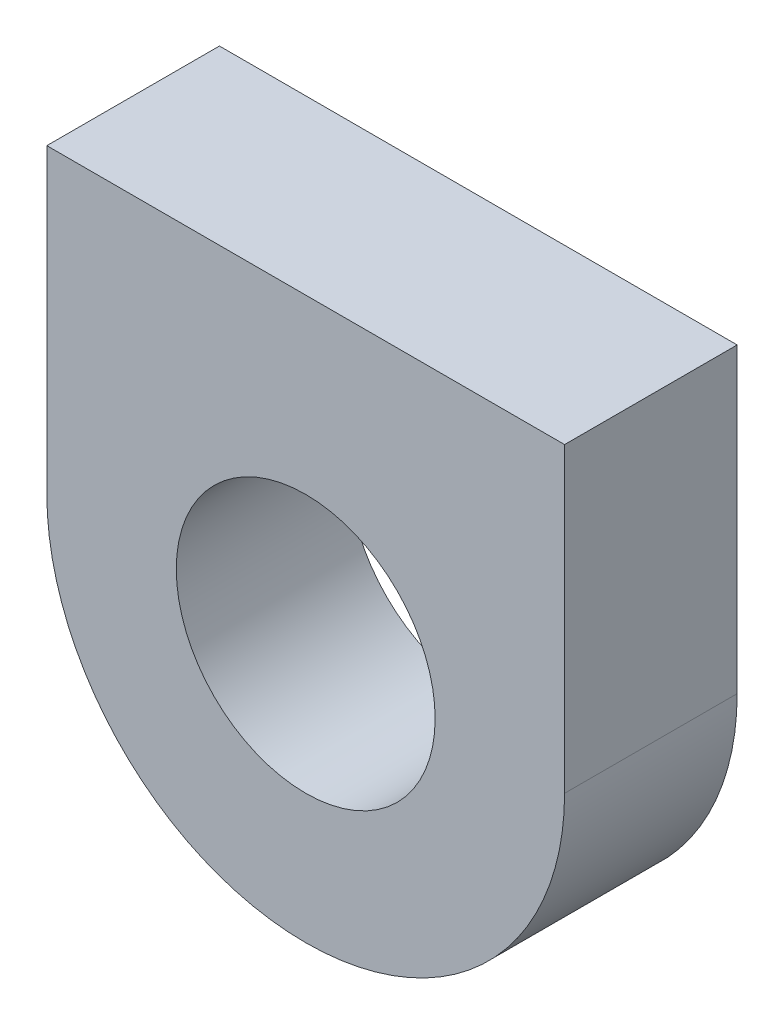
ISO-10303-21;
HEADER;
FILE_DESCRIPTION(('STEP AP214'),'2;1');
FILE_NAME('part.step','',(''),(''),'','','');
FILE_SCHEMA(('AUTOMOTIVE_DESIGN { 1 0 10303 214 1 1 1 1 }'));
ENDSEC;
DATA;
#1=APPLICATION_CONTEXT('core data for automotive mechanical design processes');
#2=APPLICATION_PROTOCOL_DEFINITION('international standard','automotive_design',2000,#1);
#3=PRODUCT_CONTEXT('',#1,'mechanical');
#4=PRODUCT('Part','Part','',(#3));
#5=PRODUCT_RELATED_PRODUCT_CATEGORY('part','',(#4));
#6=PRODUCT_DEFINITION_FORMATION('','',#4);
#7=PRODUCT_DEFINITION_CONTEXT('part definition',#1,'design');
#8=PRODUCT_DEFINITION('design','',#6,#7);
#9=PRODUCT_DEFINITION_SHAPE('','',#8);
#10=(LENGTH_UNIT() NAMED_UNIT(*) SI_UNIT(.MILLI.,.METRE.));
#11=(NAMED_UNIT(*) PLANE_ANGLE_UNIT() SI_UNIT($,.RADIAN.));
#12=(NAMED_UNIT(*) SI_UNIT($,.STERADIAN.) SOLID_ANGLE_UNIT());
#13=UNCERTAINTY_MEASURE_WITH_UNIT(LENGTH_MEASURE(1.E-05),#10,'distance_accuracy_value','');
#14=(GEOMETRIC_REPRESENTATION_CONTEXT(3) GLOBAL_UNCERTAINTY_ASSIGNED_CONTEXT((#13)) GLOBAL_UNIT_ASSIGNED_CONTEXT((#10,
#11,#12)) REPRESENTATION_CONTEXT('',''));
#15=CARTESIAN_POINT('',(0.,0.,0.));
#16=DIRECTION('',(0.,0.,1.));
#17=DIRECTION('',(1.,0.,0.));
#18=AXIS2_PLACEMENT_3D('',#15,#16,#17);
#19=CARTESIAN_POINT('',(0.,0.,10.));
#20=DIRECTION('',(0.,0.,1.));
#21=DIRECTION('',(1.,0.,0.));
#22=AXIS2_PLACEMENT_3D('',#19,#20,#21);
#23=PLANE('',#22);
#24=CARTESIAN_POINT('',(0.,0.,10.));
#25=DIRECTION('',(0.,0.,1.));
#26=DIRECTION('',(1.,0.,0.));
#27=AXIS2_PLACEMENT_3D('',#24,#25,#26);
#28=CIRCLE('',#27,30.);
#29=CARTESIAN_POINT('',(-30.,0.,10.));
#30=VERTEX_POINT('',#29);
#31=CARTESIAN_POINT('',(30.,0.,10.));
#32=VERTEX_POINT('',#31);
#33=EDGE_CURVE('E87',#30,#32,#28,.T.);
#34=ORIENTED_EDGE('',*,*,#33,.T.);
#35=DIRECTION('',(0.,1.,0.));
#36=VECTOR('',#35,1.);
#37=CARTESIAN_POINT('',(30.,35.,10.));
#38=LINE('',#37,#36);
#39=CARTESIAN_POINT('',(30.,35.,10.));
#40=VERTEX_POINT('',#39);
#41=EDGE_CURVE('E82',#32,#40,#38,.T.);
#42=ORIENTED_EDGE('',*,*,#41,.T.);
#43=DIRECTION('',(-1.,0.,0.));
#44=VECTOR('',#43,1.);
#45=CARTESIAN_POINT('',(-30.,35.,10.));
#46=LINE('',#45,#44);
#47=CARTESIAN_POINT('',(-30.,35.,10.));
#48=VERTEX_POINT('',#47);
#49=EDGE_CURVE('E85',#40,#48,#46,.T.);
#50=ORIENTED_EDGE('',*,*,#49,.T.);
#51=DIRECTION('',(0.,-1.,0.));
#52=VECTOR('',#51,1.);
#53=CARTESIAN_POINT('',(-30.,0.,10.));
#54=LINE('',#53,#52);
#55=EDGE_CURVE('E52',#48,#30,#54,.T.);
#56=ORIENTED_EDGE('',*,*,#55,.T.);
#57=EDGE_LOOP('',(#34,#42,#50,#56));
#58=FACE_BOUND('',#57,.T.);
#59=CARTESIAN_POINT('',(0.,0.,10.));
#60=DIRECTION('',(0.,0.,1.));
#61=DIRECTION('',(1.,0.,0.));
#62=AXIS2_PLACEMENT_3D('',#59,#60,#61);
#63=CIRCLE('',#62,15.);
#64=CARTESIAN_POINT('',(15.,0.,10.));
#65=VERTEX_POINT('',#64);
#66=EDGE_CURVE('E102',#65,#65,#63,.T.);
#67=ORIENTED_EDGE('',*,*,#66,.F.);
#68=EDGE_LOOP('',(#67));
#69=FACE_BOUND('',#68,.T.);
#70=ADVANCED_FACE('F35',(#58,#69),#23,.T.);
#71=CARTESIAN_POINT('',(0.,0.,-10.));
#72=DIRECTION('',(0.,0.,1.));
#73=DIRECTION('',(1.,0.,0.));
#74=AXIS2_PLACEMENT_3D('',#71,#72,#73);
#75=PLANE('',#74);
#76=CARTESIAN_POINT('',(0.,0.,-10.));
#77=DIRECTION('',(0.,0.,1.));
#78=DIRECTION('',(1.,0.,0.));
#79=AXIS2_PLACEMENT_3D('',#76,#77,#78);
#80=CIRCLE('',#79,30.);
#81=CARTESIAN_POINT('',(-30.,0.,-10.));
#82=VERTEX_POINT('',#81);
#83=CARTESIAN_POINT('',(30.,0.,-10.));
#84=VERTEX_POINT('',#83);
#85=EDGE_CURVE('E99',#82,#84,#80,.T.);
#86=ORIENTED_EDGE('',*,*,#85,.F.);
#87=DIRECTION('',(0.,-1.,0.));
#88=VECTOR('',#87,1.);
#89=CARTESIAN_POINT('',(-30.,0.,-10.));
#90=LINE('',#89,#88);
#91=CARTESIAN_POINT('',(-30.,35.,-10.));
#92=VERTEX_POINT('',#91);
#93=EDGE_CURVE('E75',#92,#82,#90,.T.);
#94=ORIENTED_EDGE('',*,*,#93,.F.);
#95=DIRECTION('',(-1.,0.,0.));
#96=VECTOR('',#95,1.);
#97=CARTESIAN_POINT('',(-30.,35.,-10.));
#98=LINE('',#97,#96);
#99=CARTESIAN_POINT('',(30.,35.,-10.));
#100=VERTEX_POINT('',#99);
#101=EDGE_CURVE('E69',#100,#92,#98,.T.);
#102=ORIENTED_EDGE('',*,*,#101,.F.);
#103=DIRECTION('',(0.,1.,0.));
#104=VECTOR('',#103,1.);
#105=CARTESIAN_POINT('',(30.,35.,-10.));
#106=LINE('',#105,#104);
#107=EDGE_CURVE('E91',#84,#100,#106,.T.);
#108=ORIENTED_EDGE('',*,*,#107,.F.);
#109=EDGE_LOOP('',(#86,#94,#102,#108));
#110=FACE_BOUND('',#109,.T.);
#111=CARTESIAN_POINT('',(0.,0.,-10.));
#112=DIRECTION('',(0.,0.,1.));
#113=DIRECTION('',(1.,0.,0.));
#114=AXIS2_PLACEMENT_3D('',#111,#112,#113);
#115=CIRCLE('',#114,15.);
#116=CARTESIAN_POINT('',(15.,0.,-10.));
#117=VERTEX_POINT('',#116);
#118=EDGE_CURVE('E114',#117,#117,#115,.T.);
#119=ORIENTED_EDGE('',*,*,#118,.T.);
#120=EDGE_LOOP('',(#119));
#121=FACE_BOUND('',#120,.T.);
#122=ADVANCED_FACE('F110',(#110,#121),#75,.F.);
#123=CARTESIAN_POINT('',(0.,0.,10.));
#124=DIRECTION('',(0.,0.,-1.));
#125=DIRECTION('',(-1.,0.,0.));
#126=AXIS2_PLACEMENT_3D('',#123,#124,#125);
#127=CYLINDRICAL_SURFACE('',#126,30.);
#128=ORIENTED_EDGE('',*,*,#85,.T.);
#129=DIRECTION('',(0.,0.,-1.));
#130=VECTOR('',#129,1.);
#131=CARTESIAN_POINT('',(30.,0.,10.));
#132=LINE('',#131,#130);
#133=EDGE_CURVE('E11',#32,#84,#132,.T.);
#134=ORIENTED_EDGE('',*,*,#133,.F.);
#135=ORIENTED_EDGE('',*,*,#33,.F.);
#136=DIRECTION('',(0.,0.,-1.));
#137=VECTOR('',#136,1.);
#138=CARTESIAN_POINT('',(-30.,0.,10.));
#139=LINE('',#138,#137);
#140=EDGE_CURVE('E95',#30,#82,#139,.T.);
#141=ORIENTED_EDGE('',*,*,#140,.T.);
#142=EDGE_LOOP('',(#128,#134,#135,#141));
#143=FACE_BOUND('',#142,.T.);
#144=ADVANCED_FACE('F37',(#143),#127,.T.);
#145=CARTESIAN_POINT('',(30.,35.,10.));
#146=DIRECTION('',(-1.,0.,0.));
#147=DIRECTION('',(0.,0.,1.));
#148=AXIS2_PLACEMENT_3D('',#145,#146,#147);
#149=PLANE('',#148);
#150=ORIENTED_EDGE('',*,*,#107,.T.);
#151=DIRECTION('',(0.,0.,-1.));
#152=VECTOR('',#151,1.);
#153=CARTESIAN_POINT('',(30.,35.,10.));
#154=LINE('',#153,#152);
#155=EDGE_CURVE('E44',#40,#100,#154,.T.);
#156=ORIENTED_EDGE('',*,*,#155,.F.);
#157=ORIENTED_EDGE('',*,*,#41,.F.);
#158=ORIENTED_EDGE('',*,*,#133,.T.);
#159=EDGE_LOOP('',(#150,#156,#157,#158));
#160=FACE_BOUND('',#159,.T.);
#161=ADVANCED_FACE('F90',(#160),#149,.F.);
#162=CARTESIAN_POINT('',(-30.,35.,10.));
#163=DIRECTION('',(0.,-1.,0.));
#164=DIRECTION('',(0.,0.,-1.));
#165=AXIS2_PLACEMENT_3D('',#162,#163,#164);
#166=PLANE('',#165);
#167=ORIENTED_EDGE('',*,*,#101,.T.);
#168=DIRECTION('',(0.,0.,-1.));
#169=VECTOR('',#168,1.);
#170=CARTESIAN_POINT('',(-30.,35.,10.));
#171=LINE('',#170,#169);
#172=EDGE_CURVE('E92',#48,#92,#171,.T.);
#173=ORIENTED_EDGE('',*,*,#172,.F.);
#174=ORIENTED_EDGE('',*,*,#49,.F.);
#175=ORIENTED_EDGE('',*,*,#155,.T.);
#176=EDGE_LOOP('',(#167,#173,#174,#175));
#177=FACE_BOUND('',#176,.T.);
#178=ADVANCED_FACE('F93',(#177),#166,.F.);
#179=CARTESIAN_POINT('',(-30.,0.,10.));
#180=DIRECTION('',(1.,0.,0.));
#181=DIRECTION('',(0.,0.,-1.));
#182=AXIS2_PLACEMENT_3D('',#179,#180,#181);
#183=PLANE('',#182);
#184=ORIENTED_EDGE('',*,*,#93,.T.);
#185=ORIENTED_EDGE('',*,*,#140,.F.);
#186=ORIENTED_EDGE('',*,*,#55,.F.);
#187=ORIENTED_EDGE('',*,*,#172,.T.);
#188=EDGE_LOOP('',(#184,#185,#186,#187));
#189=FACE_BOUND('',#188,.T.);
#190=ADVANCED_FACE('F107',(#189),#183,.F.);
#191=CARTESIAN_POINT('',(0.,0.,10.));
#192=DIRECTION('',(0.,0.,-1.));
#193=DIRECTION('',(-1.,0.,0.));
#194=AXIS2_PLACEMENT_3D('',#191,#192,#193);
#195=CYLINDRICAL_SURFACE('',#194,15.);
#196=ORIENTED_EDGE('',*,*,#66,.T.);
#197=EDGE_LOOP('',(#196));
#198=FACE_BOUND('',#197,.T.);
#199=ORIENTED_EDGE('',*,*,#118,.F.);
#200=EDGE_LOOP('',(#199));
#201=FACE_BOUND('',#200,.T.);
#202=ADVANCED_FACE('F120',(#198,#201),#195,.F.);
#203=CLOSED_SHELL('',(#70,#122,#144,#161,#178,#190,#202));
#204=MANIFOLD_SOLID_BREP('B2',#203);
#205=ADVANCED_BREP_SHAPE_REPRESENTATION('',(#18,#204),#14);
#206=SHAPE_DEFINITION_REPRESENTATION(#9,#205);
ENDSEC;
END-ISO-10303-21;
